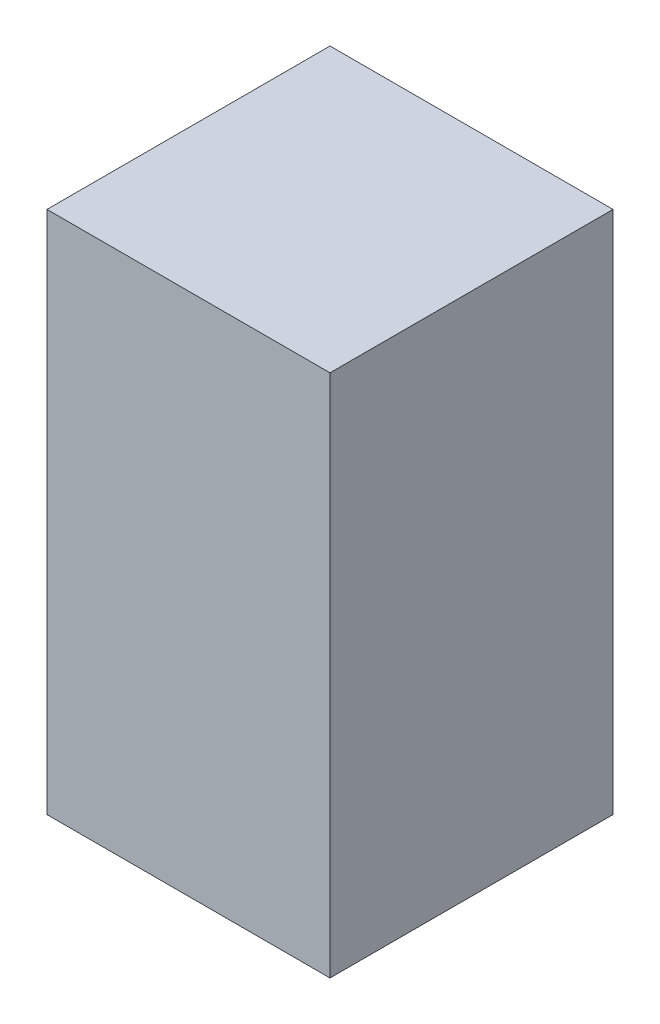
ISO-10303-21;
HEADER;
FILE_DESCRIPTION(('STEP AP214'),'2;1');
FILE_NAME('part.step','',(''),(''),'','','');
FILE_SCHEMA(('AUTOMOTIVE_DESIGN { 1 0 10303 214 1 1 1 1 }'));
ENDSEC;
DATA;
#1=APPLICATION_CONTEXT('core data for automotive mechanical design processes');
#2=APPLICATION_PROTOCOL_DEFINITION('international standard','automotive_design',2000,#1);
#3=PRODUCT_CONTEXT('',#1,'mechanical');
#4=PRODUCT('Part','Part','',(#3));
#5=PRODUCT_RELATED_PRODUCT_CATEGORY('part','',(#4));
#6=PRODUCT_DEFINITION_FORMATION('','',#4);
#7=PRODUCT_DEFINITION_CONTEXT('part definition',#1,'design');
#8=PRODUCT_DEFINITION('design','',#6,#7);
#9=PRODUCT_DEFINITION_SHAPE('','',#8);
#10=(LENGTH_UNIT() NAMED_UNIT(*) SI_UNIT(.MILLI.,.METRE.));
#11=(NAMED_UNIT(*) PLANE_ANGLE_UNIT() SI_UNIT($,.RADIAN.));
#12=(NAMED_UNIT(*) SI_UNIT($,.STERADIAN.) SOLID_ANGLE_UNIT());
#13=UNCERTAINTY_MEASURE_WITH_UNIT(LENGTH_MEASURE(1.E-05),#10,'distance_accuracy_value','');
#14=(GEOMETRIC_REPRESENTATION_CONTEXT(3) GLOBAL_UNCERTAINTY_ASSIGNED_CONTEXT((#13)) GLOBAL_UNIT_ASSIGNED_CONTEXT((#10,
#11,#12)) REPRESENTATION_CONTEXT('',''));
#15=CARTESIAN_POINT('',(0.,0.,0.));
#16=DIRECTION('',(0.,0.,1.));
#17=DIRECTION('',(1.,0.,0.));
#18=AXIS2_PLACEMENT_3D('',#15,#16,#17);
#19=CARTESIAN_POINT('',(0.,500.,0.));
#20=DIRECTION('',(1.,0.,0.));
#21=DIRECTION('',(0.,0.,-1.));
#22=AXIS2_PLACEMENT_3D('',#19,#20,#21);
#23=PLANE('',#22);
#24=DIRECTION('',(0.,0.,1.));
#25=VECTOR('',#24,1.);
#26=CARTESIAN_POINT('',(0.,0.,0.));
#27=LINE('',#26,#25);
#28=CARTESIAN_POINT('',(0.,0.,-270.));
#29=VERTEX_POINT('',#28);
#30=CARTESIAN_POINT('',(0.,0.,0.));
#31=VERTEX_POINT('',#30);
#32=EDGE_CURVE('E96',#29,#31,#27,.T.);
#33=ORIENTED_EDGE('',*,*,#32,.T.);
#34=DIRECTION('',(0.,-1.,0.));
#35=VECTOR('',#34,1.);
#36=CARTESIAN_POINT('',(0.,500.,0.));
#37=LINE('',#36,#35);
#38=CARTESIAN_POINT('',(0.,500.,0.));
#39=VERTEX_POINT('',#38);
#40=EDGE_CURVE('E11',#39,#31,#37,.T.);
#41=ORIENTED_EDGE('',*,*,#40,.F.);
#42=DIRECTION('',(0.,0.,1.));
#43=VECTOR('',#42,1.);
#44=CARTESIAN_POINT('',(0.,500.,0.));
#45=LINE('',#44,#43);
#46=CARTESIAN_POINT('',(0.,500.,-270.));
#47=VERTEX_POINT('',#46);
#48=EDGE_CURVE('E84',#47,#39,#45,.T.);
#49=ORIENTED_EDGE('',*,*,#48,.F.);
#50=DIRECTION('',(0.,-1.,0.));
#51=VECTOR('',#50,1.);
#52=CARTESIAN_POINT('',(0.,500.,-270.));
#53=LINE('',#52,#51);
#54=EDGE_CURVE('E92',#47,#29,#53,.T.);
#55=ORIENTED_EDGE('',*,*,#54,.T.);
#56=EDGE_LOOP('',(#33,#41,#49,#55));
#57=FACE_BOUND('',#56,.T.);
#58=ADVANCED_FACE('F33',(#57),#23,.F.);
#59=CARTESIAN_POINT('',(0.,500.,0.));
#60=DIRECTION('',(0.,0.,-1.));
#61=DIRECTION('',(-1.,0.,0.));
#62=AXIS2_PLACEMENT_3D('',#59,#60,#61);
#63=PLANE('',#62);
#64=DIRECTION('',(1.,0.,0.));
#65=VECTOR('',#64,1.);
#66=CARTESIAN_POINT('',(0.,0.,0.));
#67=LINE('',#66,#65);
#68=CARTESIAN_POINT('',(270.,0.,0.));
#69=VERTEX_POINT('',#68);
#70=EDGE_CURVE('E88',#31,#69,#67,.T.);
#71=ORIENTED_EDGE('',*,*,#70,.T.);
#72=DIRECTION('',(0.,-1.,0.));
#73=VECTOR('',#72,1.);
#74=CARTESIAN_POINT('',(270.,500.,0.));
#75=LINE('',#74,#73);
#76=CARTESIAN_POINT('',(270.,500.,0.));
#77=VERTEX_POINT('',#76);
#78=EDGE_CURVE('E41',#77,#69,#75,.T.);
#79=ORIENTED_EDGE('',*,*,#78,.F.);
#80=DIRECTION('',(1.,0.,0.));
#81=VECTOR('',#80,1.);
#82=CARTESIAN_POINT('',(0.,500.,0.));
#83=LINE('',#82,#81);
#84=EDGE_CURVE('E79',#39,#77,#83,.T.);
#85=ORIENTED_EDGE('',*,*,#84,.F.);
#86=ORIENTED_EDGE('',*,*,#40,.T.);
#87=EDGE_LOOP('',(#71,#79,#85,#86));
#88=FACE_BOUND('',#87,.T.);
#89=ADVANCED_FACE('F87',(#88),#63,.F.);
#90=CARTESIAN_POINT('',(270.,500.,0.));
#91=DIRECTION('',(-1.,0.,0.));
#92=DIRECTION('',(0.,0.,1.));
#93=AXIS2_PLACEMENT_3D('',#90,#91,#92);
#94=PLANE('',#93);
#95=DIRECTION('',(0.,0.,-1.));
#96=VECTOR('',#95,1.);
#97=CARTESIAN_POINT('',(270.,0.,0.));
#98=LINE('',#97,#96);
#99=CARTESIAN_POINT('',(270.,0.,-270.));
#100=VERTEX_POINT('',#99);
#101=EDGE_CURVE('E66',#69,#100,#98,.T.);
#102=ORIENTED_EDGE('',*,*,#101,.T.);
#103=DIRECTION('',(0.,-1.,0.));
#104=VECTOR('',#103,1.);
#105=CARTESIAN_POINT('',(270.,500.,-270.));
#106=LINE('',#105,#104);
#107=CARTESIAN_POINT('',(270.,500.,-270.));
#108=VERTEX_POINT('',#107);
#109=EDGE_CURVE('E89',#108,#100,#106,.T.);
#110=ORIENTED_EDGE('',*,*,#109,.F.);
#111=DIRECTION('',(0.,0.,-1.));
#112=VECTOR('',#111,1.);
#113=CARTESIAN_POINT('',(270.,500.,0.));
#114=LINE('',#113,#112);
#115=EDGE_CURVE('E82',#77,#108,#114,.T.);
#116=ORIENTED_EDGE('',*,*,#115,.F.);
#117=ORIENTED_EDGE('',*,*,#78,.T.);
#118=EDGE_LOOP('',(#102,#110,#116,#117));
#119=FACE_BOUND('',#118,.T.);
#120=ADVANCED_FACE('F90',(#119),#94,.F.);
#121=CARTESIAN_POINT('',(0.,500.,-270.));
#122=DIRECTION('',(0.,0.,1.));
#123=DIRECTION('',(1.,0.,0.));
#124=AXIS2_PLACEMENT_3D('',#121,#122,#123);
#125=PLANE('',#124);
#126=DIRECTION('',(-1.,0.,0.));
#127=VECTOR('',#126,1.);
#128=CARTESIAN_POINT('',(0.,0.,-270.));
#129=LINE('',#128,#127);
#130=EDGE_CURVE('E72',#100,#29,#129,.T.);
#131=ORIENTED_EDGE('',*,*,#130,.T.);
#132=ORIENTED_EDGE('',*,*,#54,.F.);
#133=DIRECTION('',(-1.,0.,0.));
#134=VECTOR('',#133,1.);
#135=CARTESIAN_POINT('',(0.,500.,-270.));
#136=LINE('',#135,#134);
#137=EDGE_CURVE('E49',#108,#47,#136,.T.);
#138=ORIENTED_EDGE('',*,*,#137,.F.);
#139=ORIENTED_EDGE('',*,*,#109,.T.);
#140=EDGE_LOOP('',(#131,#132,#138,#139));
#141=FACE_BOUND('',#140,.T.);
#142=ADVANCED_FACE('F103',(#141),#125,.F.);
#143=CARTESIAN_POINT('',(0.,500.,0.));
#144=DIRECTION('',(0.,-1.,0.));
#145=DIRECTION('',(0.,0.,-1.));
#146=AXIS2_PLACEMENT_3D('',#143,#144,#145);
#147=PLANE('',#146);
#148=ORIENTED_EDGE('',*,*,#48,.T.);
#149=ORIENTED_EDGE('',*,*,#84,.T.);
#150=ORIENTED_EDGE('',*,*,#115,.T.);
#151=ORIENTED_EDGE('',*,*,#137,.T.);
#152=EDGE_LOOP('',(#148,#149,#150,#151));
#153=FACE_BOUND('',#152,.T.);
#154=ADVANCED_FACE('F80',(#153),#147,.F.);
#155=CARTESIAN_POINT('',(0.,0.,0.));
#156=DIRECTION('',(0.,-1.,0.));
#157=DIRECTION('',(0.,0.,-1.));
#158=AXIS2_PLACEMENT_3D('',#155,#156,#157);
#159=PLANE('',#158);
#160=ORIENTED_EDGE('',*,*,#32,.F.);
#161=ORIENTED_EDGE('',*,*,#130,.F.);
#162=ORIENTED_EDGE('',*,*,#101,.F.);
#163=ORIENTED_EDGE('',*,*,#70,.F.);
#164=EDGE_LOOP('',(#160,#161,#162,#163));
#165=FACE_BOUND('',#164,.T.);
#166=ADVANCED_FACE('F106',(#165),#159,.T.);
#167=CLOSED_SHELL('',(#58,#89,#120,#142,#154,#166));
#168=MANIFOLD_SOLID_BREP('B2',#167);
#169=ADVANCED_BREP_SHAPE_REPRESENTATION('',(#18,#168),#14);
#170=SHAPE_DEFINITION_REPRESENTATION(#9,#169);
ENDSEC;
END-ISO-10303-21;
